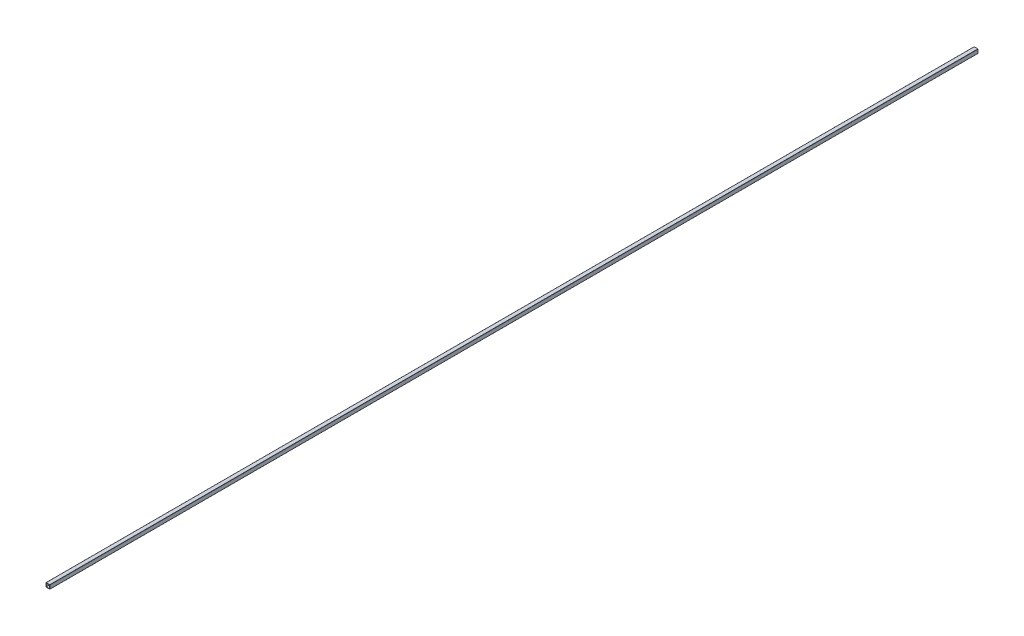
ISO-10303-21;
HEADER;
FILE_DESCRIPTION(('STEP AP214'),'2;1');
FILE_NAME('part.step','',(''),(''),'','','');
FILE_SCHEMA(('AUTOMOTIVE_DESIGN { 1 0 10303 214 1 1 1 1 }'));
ENDSEC;
DATA;
#1=APPLICATION_CONTEXT('core data for automotive mechanical design processes');
#2=APPLICATION_PROTOCOL_DEFINITION('international standard','automotive_design',2000,#1);
#3=PRODUCT_CONTEXT('',#1,'mechanical');
#4=PRODUCT('Part','Part','',(#3));
#5=PRODUCT_RELATED_PRODUCT_CATEGORY('part','',(#4));
#6=PRODUCT_DEFINITION_FORMATION('','',#4);
#7=PRODUCT_DEFINITION_CONTEXT('part definition',#1,'design');
#8=PRODUCT_DEFINITION('design','',#6,#7);
#9=PRODUCT_DEFINITION_SHAPE('','',#8);
#10=(LENGTH_UNIT() NAMED_UNIT(*) SI_UNIT(.MILLI.,.METRE.));
#11=(NAMED_UNIT(*) PLANE_ANGLE_UNIT() SI_UNIT($,.RADIAN.));
#12=(NAMED_UNIT(*) SI_UNIT($,.STERADIAN.) SOLID_ANGLE_UNIT());
#13=UNCERTAINTY_MEASURE_WITH_UNIT(LENGTH_MEASURE(1.E-05),#10,'distance_accuracy_value','');
#14=(GEOMETRIC_REPRESENTATION_CONTEXT(3) GLOBAL_UNCERTAINTY_ASSIGNED_CONTEXT((#13)) GLOBAL_UNIT_ASSIGNED_CONTEXT((#10,
#11,#12)) REPRESENTATION_CONTEXT('',''));
#15=CARTESIAN_POINT('',(0.,0.,0.));
#16=DIRECTION('',(0.,0.,1.));
#17=DIRECTION('',(1.,0.,0.));
#18=AXIS2_PLACEMENT_3D('',#15,#16,#17);
#19=CARTESIAN_POINT('',(11.7,11.7,6000.));
#20=DIRECTION('',(0.,0.,-1.));
#21=DIRECTION('',(-1.,0.,0.));
#22=AXIS2_PLACEMENT_3D('',#19,#20,#21);
#23=PLANE('',#22);
#24=CARTESIAN_POINT('',(11.7,11.7,6000.));
#25=DIRECTION('',(0.,0.,1.));
#26=DIRECTION('',(-1.,0.,0.));
#27=AXIS2_PLACEMENT_3D('',#24,#25,#26);
#28=CIRCLE('',#27,0.999999999999999);
#29=CARTESIAN_POINT('',(12.7,11.7,6000.));
#30=VERTEX_POINT('',#29);
#31=CARTESIAN_POINT('',(11.7,12.7,6000.));
#32=VERTEX_POINT('',#31);
#33=EDGE_CURVE('E158',#30,#32,#28,.T.);
#34=ORIENTED_EDGE('',*,*,#33,.T.);
#35=DIRECTION('',(-1.,0.,0.));
#36=VECTOR('',#35,1.);
#37=CARTESIAN_POINT('',(-11.7,12.7,6000.));
#38=LINE('',#37,#36);
#39=CARTESIAN_POINT('',(-11.7,12.7,6000.));
#40=VERTEX_POINT('',#39);
#41=EDGE_CURVE('E161',#32,#40,#38,.T.);
#42=ORIENTED_EDGE('',*,*,#41,.T.);
#43=CARTESIAN_POINT('',(-11.7,11.7,6000.));
#44=DIRECTION('',(0.,0.,1.));
#45=DIRECTION('',(-1.,0.,0.));
#46=AXIS2_PLACEMENT_3D('',#43,#44,#45);
#47=CIRCLE('',#46,0.999999999999999);
#48=CARTESIAN_POINT('',(-12.7,11.7,6000.));
#49=VERTEX_POINT('',#48);
#50=EDGE_CURVE('E164',#40,#49,#47,.T.);
#51=ORIENTED_EDGE('',*,*,#50,.T.);
#52=DIRECTION('',(0.,-1.,0.));
#53=VECTOR('',#52,1.);
#54=CARTESIAN_POINT('',(-12.7,-11.7,6000.));
#55=LINE('',#54,#53);
#56=CARTESIAN_POINT('',(-12.7,-11.7,6000.));
#57=VERTEX_POINT('',#56);
#58=EDGE_CURVE('E166',#49,#57,#55,.T.);
#59=ORIENTED_EDGE('',*,*,#58,.T.);
#60=CARTESIAN_POINT('',(-11.7,-11.7,6000.));
#61=DIRECTION('',(0.,0.,1.));
#62=DIRECTION('',(-1.,0.,0.));
#63=AXIS2_PLACEMENT_3D('',#60,#61,#62);
#64=CIRCLE('',#63,0.999999999999999);
#65=CARTESIAN_POINT('',(-11.7,-12.7,6000.));
#66=VERTEX_POINT('',#65);
#67=EDGE_CURVE('E168',#57,#66,#64,.T.);
#68=ORIENTED_EDGE('',*,*,#67,.T.);
#69=DIRECTION('',(1.,0.,0.));
#70=VECTOR('',#69,1.);
#71=CARTESIAN_POINT('',(-11.7,-12.7,6000.));
#72=LINE('',#71,#70);
#73=CARTESIAN_POINT('',(11.7,-12.7,6000.));
#74=VERTEX_POINT('',#73);
#75=EDGE_CURVE('E170',#66,#74,#72,.T.);
#76=ORIENTED_EDGE('',*,*,#75,.T.);
#77=CARTESIAN_POINT('',(11.7,-11.7,6000.));
#78=DIRECTION('',(0.,0.,1.));
#79=DIRECTION('',(1.,0.,0.));
#80=AXIS2_PLACEMENT_3D('',#77,#78,#79);
#81=CIRCLE('',#80,0.999999999999999);
#82=CARTESIAN_POINT('',(12.7,-11.7,6000.));
#83=VERTEX_POINT('',#82);
#84=EDGE_CURVE('E172',#74,#83,#81,.T.);
#85=ORIENTED_EDGE('',*,*,#84,.T.);
#86=DIRECTION('',(0.,1.,0.));
#87=VECTOR('',#86,1.);
#88=CARTESIAN_POINT('',(12.7,-11.7,6000.));
#89=LINE('',#88,#87);
#90=EDGE_CURVE('E174',#83,#30,#89,.T.);
#91=ORIENTED_EDGE('',*,*,#90,.T.);
#92=EDGE_LOOP('',(#34,#42,#51,#59,#68,#76,#85,#91));
#93=FACE_BOUND('',#92,.T.);
#94=DIRECTION('',(1.,0.,0.));
#95=VECTOR('',#94,1.);
#96=CARTESIAN_POINT('',(-10.81,-10.81,6000.));
#97=LINE('',#96,#95);
#98=CARTESIAN_POINT('',(-10.81,-10.81,6000.));
#99=VERTEX_POINT('',#98);
#100=CARTESIAN_POINT('',(10.81,-10.81,6000.));
#101=VERTEX_POINT('',#100);
#102=EDGE_CURVE('E122',#99,#101,#97,.T.);
#103=ORIENTED_EDGE('',*,*,#102,.F.);
#104=DIRECTION('',(0.,-1.,0.));
#105=VECTOR('',#104,1.);
#106=CARTESIAN_POINT('',(-10.81,-10.81,6000.));
#107=LINE('',#106,#105);
#108=CARTESIAN_POINT('',(-10.81,10.81,6000.));
#109=VERTEX_POINT('',#108);
#110=EDGE_CURVE('E144',#109,#99,#107,.T.);
#111=ORIENTED_EDGE('',*,*,#110,.F.);
#112=DIRECTION('',(-1.,0.,0.));
#113=VECTOR('',#112,1.);
#114=CARTESIAN_POINT('',(-10.81,10.81,6000.));
#115=LINE('',#114,#113);
#116=CARTESIAN_POINT('',(10.81,10.81,6000.));
#117=VERTEX_POINT('',#116);
#118=EDGE_CURVE('E142',#117,#109,#115,.T.);
#119=ORIENTED_EDGE('',*,*,#118,.F.);
#120=DIRECTION('',(0.,1.,0.));
#121=VECTOR('',#120,1.);
#122=CARTESIAN_POINT('',(10.81,-10.81,6000.));
#123=LINE('',#122,#121);
#124=EDGE_CURVE('E130',#101,#117,#123,.T.);
#125=ORIENTED_EDGE('',*,*,#124,.F.);
#126=EDGE_LOOP('',(#103,#111,#119,#125));
#127=FACE_BOUND('',#126,.T.);
#128=ADVANCED_FACE('F33',(#93,#127),#23,.F.);
#129=CARTESIAN_POINT('',(11.7,11.7,0.));
#130=DIRECTION('',(0.,0.,-1.));
#131=DIRECTION('',(-1.,0.,0.));
#132=AXIS2_PLACEMENT_3D('',#129,#130,#131);
#133=PLANE('',#132);
#134=CARTESIAN_POINT('',(11.7,11.7,0.));
#135=DIRECTION('',(0.,0.,1.));
#136=DIRECTION('',(-1.,0.,0.));
#137=AXIS2_PLACEMENT_3D('',#134,#135,#136);
#138=CIRCLE('',#137,0.999999999999999);
#139=CARTESIAN_POINT('',(12.7,11.7,0.));
#140=VERTEX_POINT('',#139);
#141=CARTESIAN_POINT('',(11.7,12.7,0.));
#142=VERTEX_POINT('',#141);
#143=EDGE_CURVE('E138',#140,#142,#138,.T.);
#144=ORIENTED_EDGE('',*,*,#143,.F.);
#145=DIRECTION('',(0.,1.,0.));
#146=VECTOR('',#145,1.);
#147=CARTESIAN_POINT('',(12.7,-11.7,0.));
#148=LINE('',#147,#146);
#149=CARTESIAN_POINT('',(12.7,-11.7,0.));
#150=VERTEX_POINT('',#149);
#151=EDGE_CURVE('E162',#150,#140,#148,.T.);
#152=ORIENTED_EDGE('',*,*,#151,.F.);
#153=CARTESIAN_POINT('',(11.7,-11.7,0.));
#154=DIRECTION('',(0.,0.,1.));
#155=DIRECTION('',(1.,0.,0.));
#156=AXIS2_PLACEMENT_3D('',#153,#154,#155);
#157=CIRCLE('',#156,0.999999999999999);
#158=CARTESIAN_POINT('',(11.7,-12.7,0.));
#159=VERTEX_POINT('',#158);
#160=EDGE_CURVE('E189',#159,#150,#157,.T.);
#161=ORIENTED_EDGE('',*,*,#160,.F.);
#162=DIRECTION('',(1.,0.,0.));
#163=VECTOR('',#162,1.);
#164=CARTESIAN_POINT('',(-11.7,-12.7,0.));
#165=LINE('',#164,#163);
#166=CARTESIAN_POINT('',(-11.7,-12.7,0.));
#167=VERTEX_POINT('',#166);
#168=EDGE_CURVE('E187',#167,#159,#165,.T.);
#169=ORIENTED_EDGE('',*,*,#168,.F.);
#170=CARTESIAN_POINT('',(-11.7,-11.7,0.));
#171=DIRECTION('',(0.,0.,1.));
#172=DIRECTION('',(-1.,0.,0.));
#173=AXIS2_PLACEMENT_3D('',#170,#171,#172);
#174=CIRCLE('',#173,0.999999999999999);
#175=CARTESIAN_POINT('',(-12.7,-11.7,0.));
#176=VERTEX_POINT('',#175);
#177=EDGE_CURVE('E185',#176,#167,#174,.T.);
#178=ORIENTED_EDGE('',*,*,#177,.F.);
#179=DIRECTION('',(0.,-1.,0.));
#180=VECTOR('',#179,1.);
#181=CARTESIAN_POINT('',(-12.7,-11.7,0.));
#182=LINE('',#181,#180);
#183=CARTESIAN_POINT('',(-12.7,11.7,0.));
#184=VERTEX_POINT('',#183);
#185=EDGE_CURVE('E183',#184,#176,#182,.T.);
#186=ORIENTED_EDGE('',*,*,#185,.F.);
#187=CARTESIAN_POINT('',(-11.7,11.7,0.));
#188=DIRECTION('',(0.,0.,1.));
#189=DIRECTION('',(-1.,0.,0.));
#190=AXIS2_PLACEMENT_3D('',#187,#188,#189);
#191=CIRCLE('',#190,0.999999999999999);
#192=CARTESIAN_POINT('',(-11.7,12.7,0.));
#193=VERTEX_POINT('',#192);
#194=EDGE_CURVE('E181',#193,#184,#191,.T.);
#195=ORIENTED_EDGE('',*,*,#194,.F.);
#196=DIRECTION('',(-1.,0.,0.));
#197=VECTOR('',#196,1.);
#198=CARTESIAN_POINT('',(-11.7,12.7,0.));
#199=LINE('',#198,#197);
#200=EDGE_CURVE('E179',#142,#193,#199,.T.);
#201=ORIENTED_EDGE('',*,*,#200,.F.);
#202=EDGE_LOOP('',(#144,#152,#161,#169,#178,#186,#195,#201));
#203=FACE_BOUND('',#202,.T.);
#204=DIRECTION('',(0.,-1.,0.));
#205=VECTOR('',#204,1.);
#206=CARTESIAN_POINT('',(-10.81,-10.81,0.));
#207=LINE('',#206,#205);
#208=CARTESIAN_POINT('',(-10.81,10.81,0.));
#209=VERTEX_POINT('',#208);
#210=CARTESIAN_POINT('',(-10.81,-10.81,0.));
#211=VERTEX_POINT('',#210);
#212=EDGE_CURVE('E131',#209,#211,#207,.T.);
#213=ORIENTED_EDGE('',*,*,#212,.T.);
#214=DIRECTION('',(1.,0.,0.));
#215=VECTOR('',#214,1.);
#216=CARTESIAN_POINT('',(-10.81,-10.81,0.));
#217=LINE('',#216,#215);
#218=CARTESIAN_POINT('',(10.81,-10.81,0.));
#219=VERTEX_POINT('',#218);
#220=EDGE_CURVE('E56',#211,#219,#217,.T.);
#221=ORIENTED_EDGE('',*,*,#220,.T.);
#222=DIRECTION('',(0.,1.,0.));
#223=VECTOR('',#222,1.);
#224=CARTESIAN_POINT('',(10.81,-10.81,0.));
#225=LINE('',#224,#223);
#226=CARTESIAN_POINT('',(10.81,10.81,0.));
#227=VERTEX_POINT('',#226);
#228=EDGE_CURVE('E137',#219,#227,#225,.T.);
#229=ORIENTED_EDGE('',*,*,#228,.T.);
#230=DIRECTION('',(-1.,0.,0.));
#231=VECTOR('',#230,1.);
#232=CARTESIAN_POINT('',(-10.81,10.81,0.));
#233=LINE('',#232,#231);
#234=EDGE_CURVE('E150',#227,#209,#233,.T.);
#235=ORIENTED_EDGE('',*,*,#234,.T.);
#236=EDGE_LOOP('',(#213,#221,#229,#235));
#237=FACE_BOUND('',#236,.T.);
#238=ADVANCED_FACE('F219',(#203,#237),#133,.T.);
#239=CARTESIAN_POINT('',(11.7,11.7,6000.));
#240=DIRECTION('',(0.,0.,-1.));
#241=DIRECTION('',(-1.,0.,0.));
#242=AXIS2_PLACEMENT_3D('',#239,#240,#241);
#243=CYLINDRICAL_SURFACE('',#242,0.999999999999999);
#244=ORIENTED_EDGE('',*,*,#143,.T.);
#245=DIRECTION('',(0.,0.,-1.));
#246=VECTOR('',#245,1.);
#247=CARTESIAN_POINT('',(11.7,12.7,6000.));
#248=LINE('',#247,#246);
#249=EDGE_CURVE('E11',#32,#142,#248,.T.);
#250=ORIENTED_EDGE('',*,*,#249,.F.);
#251=ORIENTED_EDGE('',*,*,#33,.F.);
#252=DIRECTION('',(0.,0.,-1.));
#253=VECTOR('',#252,1.);
#254=CARTESIAN_POINT('',(12.7,11.7,6000.));
#255=LINE('',#254,#253);
#256=EDGE_CURVE('E176',#30,#140,#255,.T.);
#257=ORIENTED_EDGE('',*,*,#256,.T.);
#258=EDGE_LOOP('',(#244,#250,#251,#257));
#259=FACE_BOUND('',#258,.T.);
#260=ADVANCED_FACE('F35',(#259),#243,.T.);
#261=CARTESIAN_POINT('',(-11.7,12.7,6000.));
#262=DIRECTION('',(0.,-1.,0.));
#263=DIRECTION('',(0.,0.,-1.));
#264=AXIS2_PLACEMENT_3D('',#261,#262,#263);
#265=PLANE('',#264);
#266=ORIENTED_EDGE('',*,*,#200,.T.);
#267=DIRECTION('',(0.,0.,-1.));
#268=VECTOR('',#267,1.);
#269=CARTESIAN_POINT('',(-11.7,12.7,6000.));
#270=LINE('',#269,#268);
#271=EDGE_CURVE('E41',#40,#193,#270,.T.);
#272=ORIENTED_EDGE('',*,*,#271,.F.);
#273=ORIENTED_EDGE('',*,*,#41,.F.);
#274=ORIENTED_EDGE('',*,*,#249,.T.);
#275=EDGE_LOOP('',(#266,#272,#273,#274));
#276=FACE_BOUND('',#275,.T.);
#277=ADVANCED_FACE('F236',(#276),#265,.F.);
#278=CARTESIAN_POINT('',(-11.7,11.7,6000.));
#279=DIRECTION('',(0.,0.,-1.));
#280=DIRECTION('',(-1.,0.,0.));
#281=AXIS2_PLACEMENT_3D('',#278,#279,#280);
#282=CYLINDRICAL_SURFACE('',#281,0.999999999999999);
#283=ORIENTED_EDGE('',*,*,#194,.T.);
#284=DIRECTION('',(0.,0.,-1.));
#285=VECTOR('',#284,1.);
#286=CARTESIAN_POINT('',(-12.7,11.7,6000.));
#287=LINE('',#286,#285);
#288=EDGE_CURVE('E206',#49,#184,#287,.T.);
#289=ORIENTED_EDGE('',*,*,#288,.F.);
#290=ORIENTED_EDGE('',*,*,#50,.F.);
#291=ORIENTED_EDGE('',*,*,#271,.T.);
#292=EDGE_LOOP('',(#283,#289,#290,#291));
#293=FACE_BOUND('',#292,.T.);
#294=ADVANCED_FACE('F213',(#293),#282,.T.);
#295=CARTESIAN_POINT('',(-12.7,-11.7,6000.));
#296=DIRECTION('',(1.,0.,0.));
#297=DIRECTION('',(0.,0.,-1.));
#298=AXIS2_PLACEMENT_3D('',#295,#296,#297);
#299=PLANE('',#298);
#300=ORIENTED_EDGE('',*,*,#185,.T.);
#301=DIRECTION('',(0.,0.,-1.));
#302=VECTOR('',#301,1.);
#303=CARTESIAN_POINT('',(-12.7,-11.7,6000.));
#304=LINE('',#303,#302);
#305=EDGE_CURVE('E203',#57,#176,#304,.T.);
#306=ORIENTED_EDGE('',*,*,#305,.F.);
#307=ORIENTED_EDGE('',*,*,#58,.F.);
#308=ORIENTED_EDGE('',*,*,#288,.T.);
#309=EDGE_LOOP('',(#300,#306,#307,#308));
#310=FACE_BOUND('',#309,.T.);
#311=ADVANCED_FACE('F225',(#310),#299,.F.);
#312=CARTESIAN_POINT('',(-11.7,-11.7,6000.));
#313=DIRECTION('',(0.,0.,-1.));
#314=DIRECTION('',(-1.,0.,0.));
#315=AXIS2_PLACEMENT_3D('',#312,#313,#314);
#316=CYLINDRICAL_SURFACE('',#315,0.999999999999999);
#317=ORIENTED_EDGE('',*,*,#177,.T.);
#318=DIRECTION('',(0.,0.,-1.));
#319=VECTOR('',#318,1.);
#320=CARTESIAN_POINT('',(-11.7,-12.7,6000.));
#321=LINE('',#320,#319);
#322=EDGE_CURVE('E200',#66,#167,#321,.T.);
#323=ORIENTED_EDGE('',*,*,#322,.F.);
#324=ORIENTED_EDGE('',*,*,#67,.F.);
#325=ORIENTED_EDGE('',*,*,#305,.T.);
#326=EDGE_LOOP('',(#317,#323,#324,#325));
#327=FACE_BOUND('',#326,.T.);
#328=ADVANCED_FACE('F229',(#327),#316,.T.);
#329=CARTESIAN_POINT('',(-11.7,-12.7,6000.));
#330=DIRECTION('',(0.,1.,0.));
#331=DIRECTION('',(0.,0.,1.));
#332=AXIS2_PLACEMENT_3D('',#329,#330,#331);
#333=PLANE('',#332);
#334=ORIENTED_EDGE('',*,*,#168,.T.);
#335=DIRECTION('',(0.,0.,-1.));
#336=VECTOR('',#335,1.);
#337=CARTESIAN_POINT('',(11.7,-12.7,6000.));
#338=LINE('',#337,#336);
#339=EDGE_CURVE('E197',#74,#159,#338,.T.);
#340=ORIENTED_EDGE('',*,*,#339,.F.);
#341=ORIENTED_EDGE('',*,*,#75,.F.);
#342=ORIENTED_EDGE('',*,*,#322,.T.);
#343=EDGE_LOOP('',(#334,#340,#341,#342));
#344=FACE_BOUND('',#343,.T.);
#345=ADVANCED_FACE('F249',(#344),#333,.F.);
#346=CARTESIAN_POINT('',(11.7,-11.7,6000.));
#347=DIRECTION('',(0.,0.,-1.));
#348=DIRECTION('',(-1.,0.,0.));
#349=AXIS2_PLACEMENT_3D('',#346,#347,#348);
#350=CYLINDRICAL_SURFACE('',#349,0.999999999999999);
#351=ORIENTED_EDGE('',*,*,#160,.T.);
#352=DIRECTION('',(0.,0.,-1.));
#353=VECTOR('',#352,1.);
#354=CARTESIAN_POINT('',(12.7,-11.7,6000.));
#355=LINE('',#354,#353);
#356=EDGE_CURVE('E194',#83,#150,#355,.T.);
#357=ORIENTED_EDGE('',*,*,#356,.F.);
#358=ORIENTED_EDGE('',*,*,#84,.F.);
#359=ORIENTED_EDGE('',*,*,#339,.T.);
#360=EDGE_LOOP('',(#351,#357,#358,#359));
#361=FACE_BOUND('',#360,.T.);
#362=ADVANCED_FACE('F247',(#361),#350,.T.);
#363=CARTESIAN_POINT('',(12.7,-11.7,6000.));
#364=DIRECTION('',(-1.,0.,0.));
#365=DIRECTION('',(0.,-1.,0.));
#366=AXIS2_PLACEMENT_3D('',#363,#364,#365);
#367=PLANE('',#366);
#368=ORIENTED_EDGE('',*,*,#151,.T.);
#369=ORIENTED_EDGE('',*,*,#256,.F.);
#370=ORIENTED_EDGE('',*,*,#90,.F.);
#371=ORIENTED_EDGE('',*,*,#356,.T.);
#372=EDGE_LOOP('',(#368,#369,#370,#371));
#373=FACE_BOUND('',#372,.T.);
#374=ADVANCED_FACE('F242',(#373),#367,.F.);
#375=CARTESIAN_POINT('',(-10.81,-10.81,6000.));
#376=DIRECTION('',(0.,1.,0.));
#377=DIRECTION('',(0.,0.,1.));
#378=AXIS2_PLACEMENT_3D('',#375,#376,#377);
#379=PLANE('',#378);
#380=ORIENTED_EDGE('',*,*,#220,.F.);
#381=DIRECTION('',(0.,0.,-1.));
#382=VECTOR('',#381,1.);
#383=CARTESIAN_POINT('',(-10.81,-10.81,6000.));
#384=LINE('',#383,#382);
#385=EDGE_CURVE('E126',#99,#211,#384,.T.);
#386=ORIENTED_EDGE('',*,*,#385,.F.);
#387=ORIENTED_EDGE('',*,*,#102,.T.);
#388=DIRECTION('',(0.,0.,-1.));
#389=VECTOR('',#388,1.);
#390=CARTESIAN_POINT('',(10.81,-10.81,6000.));
#391=LINE('',#390,#389);
#392=EDGE_CURVE('E125',#101,#219,#391,.T.);
#393=ORIENTED_EDGE('',*,*,#392,.T.);
#394=EDGE_LOOP('',(#380,#386,#387,#393));
#395=FACE_BOUND('',#394,.T.);
#396=ADVANCED_FACE('F124',(#395),#379,.T.);
#397=CARTESIAN_POINT('',(10.81,-10.81,6000.));
#398=DIRECTION('',(-1.,0.,0.));
#399=DIRECTION('',(0.,0.,1.));
#400=AXIS2_PLACEMENT_3D('',#397,#398,#399);
#401=PLANE('',#400);
#402=ORIENTED_EDGE('',*,*,#228,.F.);
#403=ORIENTED_EDGE('',*,*,#392,.F.);
#404=ORIENTED_EDGE('',*,*,#124,.T.);
#405=DIRECTION('',(0.,0.,-1.));
#406=VECTOR('',#405,1.);
#407=CARTESIAN_POINT('',(10.81,10.81,6000.));
#408=LINE('',#407,#406);
#409=EDGE_CURVE('E139',#117,#227,#408,.T.);
#410=ORIENTED_EDGE('',*,*,#409,.T.);
#411=EDGE_LOOP('',(#402,#403,#404,#410));
#412=FACE_BOUND('',#411,.T.);
#413=ADVANCED_FACE('F134',(#412),#401,.T.);
#414=CARTESIAN_POINT('',(-10.81,10.81,6000.));
#415=DIRECTION('',(0.,-1.,0.));
#416=DIRECTION('',(1.,0.,0.));
#417=AXIS2_PLACEMENT_3D('',#414,#415,#416);
#418=PLANE('',#417);
#419=ORIENTED_EDGE('',*,*,#234,.F.);
#420=ORIENTED_EDGE('',*,*,#409,.F.);
#421=ORIENTED_EDGE('',*,*,#118,.T.);
#422=DIRECTION('',(0.,0.,-1.));
#423=VECTOR('',#422,1.);
#424=CARTESIAN_POINT('',(-10.81,10.81,6000.));
#425=LINE('',#424,#423);
#426=EDGE_CURVE('E48',#109,#209,#425,.T.);
#427=ORIENTED_EDGE('',*,*,#426,.T.);
#428=EDGE_LOOP('',(#419,#420,#421,#427));
#429=FACE_BOUND('',#428,.T.);
#430=ADVANCED_FACE('F274',(#429),#418,.T.);
#431=CARTESIAN_POINT('',(-10.81,-10.81,6000.));
#432=DIRECTION('',(1.,0.,0.));
#433=DIRECTION('',(0.,0.,-1.));
#434=AXIS2_PLACEMENT_3D('',#431,#432,#433);
#435=PLANE('',#434);
#436=ORIENTED_EDGE('',*,*,#212,.F.);
#437=ORIENTED_EDGE('',*,*,#426,.F.);
#438=ORIENTED_EDGE('',*,*,#110,.T.);
#439=ORIENTED_EDGE('',*,*,#385,.T.);
#440=EDGE_LOOP('',(#436,#437,#438,#439));
#441=FACE_BOUND('',#440,.T.);
#442=ADVANCED_FACE('F278',(#441),#435,.T.);
#443=CLOSED_SHELL('',(#128,#238,#260,#277,#294,#311,#328,#345,#362,#374,#396,#413,#430,#442));
#444=MANIFOLD_SOLID_BREP('B2',#443);
#445=ADVANCED_BREP_SHAPE_REPRESENTATION('',(#18,#444),#14);
#446=SHAPE_DEFINITION_REPRESENTATION(#9,#445);
ENDSEC;
END-ISO-10303-21;
